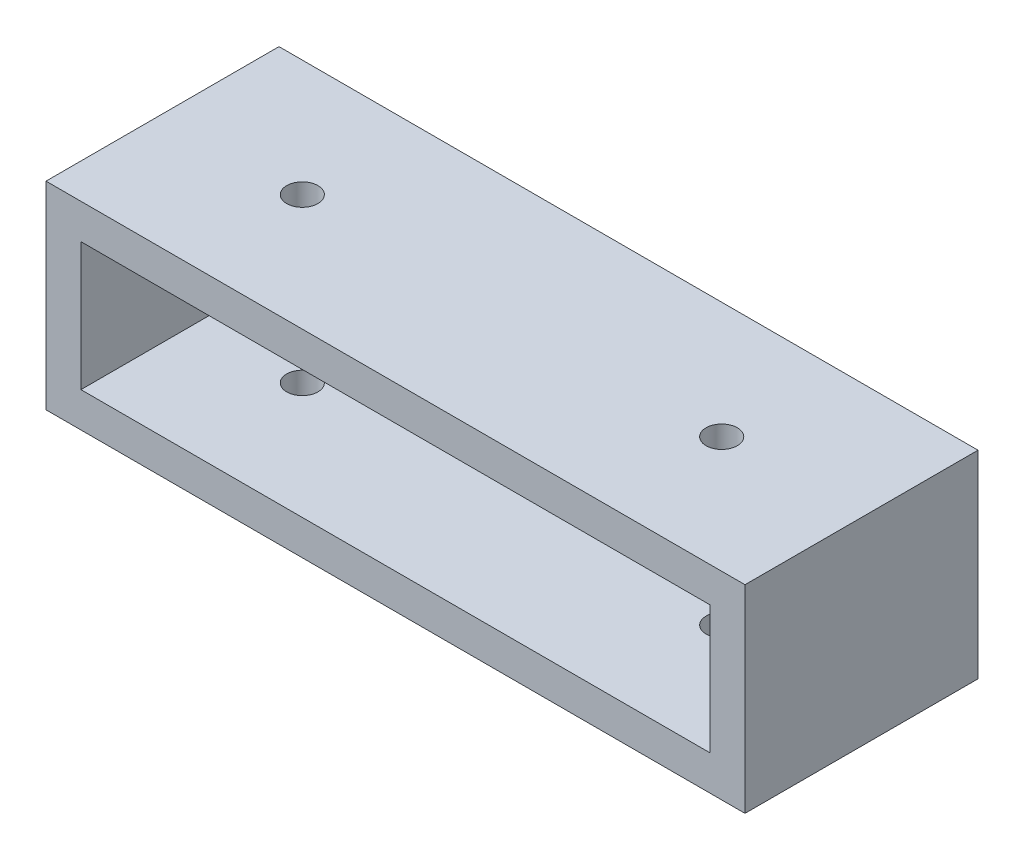
ISO-10303-21;
HEADER;
FILE_DESCRIPTION(('STEP AP214'),'2;1');
FILE_NAME('part.step','',(''),(''),'','','');
FILE_SCHEMA(('AUTOMOTIVE_DESIGN { 1 0 10303 214 1 1 1 1 }'));
ENDSEC;
DATA;
#1=APPLICATION_CONTEXT('core data for automotive mechanical design processes');
#2=APPLICATION_PROTOCOL_DEFINITION('international standard','automotive_design',2000,#1);
#3=PRODUCT_CONTEXT('',#1,'mechanical');
#4=PRODUCT('Part','Part','',(#3));
#5=PRODUCT_RELATED_PRODUCT_CATEGORY('part','',(#4));
#6=PRODUCT_DEFINITION_FORMATION('','',#4);
#7=PRODUCT_DEFINITION_CONTEXT('part definition',#1,'design');
#8=PRODUCT_DEFINITION('design','',#6,#7);
#9=PRODUCT_DEFINITION_SHAPE('','',#8);
#10=(LENGTH_UNIT() NAMED_UNIT(*) SI_UNIT(.MILLI.,.METRE.));
#11=(NAMED_UNIT(*) PLANE_ANGLE_UNIT() SI_UNIT($,.RADIAN.));
#12=(NAMED_UNIT(*) SI_UNIT($,.STERADIAN.) SOLID_ANGLE_UNIT());
#13=UNCERTAINTY_MEASURE_WITH_UNIT(LENGTH_MEASURE(1.E-05),#10,'distance_accuracy_value','');
#14=(GEOMETRIC_REPRESENTATION_CONTEXT(3) GLOBAL_UNCERTAINTY_ASSIGNED_CONTEXT((#13)) GLOBAL_UNIT_ASSIGNED_CONTEXT((#10,
#11,#12)) REPRESENTATION_CONTEXT('',''));
#15=CARTESIAN_POINT('',(0.,0.,0.));
#16=DIRECTION('',(0.,0.,1.));
#17=DIRECTION('',(1.,0.,0.));
#18=AXIS2_PLACEMENT_3D('',#15,#16,#17);
#19=CARTESIAN_POINT('',(0.,0.,0.));
#20=DIRECTION('',(0.,1.,0.));
#21=DIRECTION('',(0.,0.,1.));
#22=AXIS2_PLACEMENT_3D('',#19,#20,#21);
#23=PLANE('',#22);
#24=CARTESIAN_POINT('',(-45.,0.,0.));
#25=DIRECTION('',(0.,1.,0.));
#26=DIRECTION('',(0.,0.,1.));
#27=AXIS2_PLACEMENT_3D('',#24,#25,#26);
#28=CIRCLE('',#27,3.35);
#29=CARTESIAN_POINT('',(-45.,0.,3.35));
#30=VERTEX_POINT('',#29);
#31=EDGE_CURVE('E161',#30,#30,#28,.T.);
#32=ORIENTED_EDGE('',*,*,#31,.T.);
#33=EDGE_LOOP('',(#32));
#34=FACE_BOUND('',#33,.T.);
#35=CARTESIAN_POINT('',(45.,0.,0.));
#36=DIRECTION('',(0.,1.,0.));
#37=DIRECTION('',(0.,0.,1.));
#38=AXIS2_PLACEMENT_3D('',#35,#36,#37);
#39=CIRCLE('',#38,3.35);
#40=CARTESIAN_POINT('',(45.,0.,3.35));
#41=VERTEX_POINT('',#40);
#42=EDGE_CURVE('E168',#41,#41,#39,.T.);
#43=ORIENTED_EDGE('',*,*,#42,.T.);
#44=EDGE_LOOP('',(#43));
#45=FACE_BOUND('',#44,.T.);
#46=DIRECTION('',(-1.,0.,0.));
#47=VECTOR('',#46,1.);
#48=CARTESIAN_POINT('',(-75.,0.,-25.));
#49=LINE('',#48,#47);
#50=CARTESIAN_POINT('',(67.5,0.,-25.));
#51=VERTEX_POINT('',#50);
#52=CARTESIAN_POINT('',(-67.5,0.,-25.));
#53=VERTEX_POINT('',#52);
#54=EDGE_CURVE('E164',#51,#53,#49,.T.);
#55=ORIENTED_EDGE('',*,*,#54,.F.);
#56=DIRECTION('',(0.,0.,-1.));
#57=VECTOR('',#56,1.);
#58=CARTESIAN_POINT('',(67.5,0.,-25.));
#59=LINE('',#58,#57);
#60=CARTESIAN_POINT('',(67.5,0.,25.));
#61=VERTEX_POINT('',#60);
#62=EDGE_CURVE('E123',#61,#51,#59,.T.);
#63=ORIENTED_EDGE('',*,*,#62,.F.);
#64=DIRECTION('',(1.,0.,0.));
#65=VECTOR('',#64,1.);
#66=CARTESIAN_POINT('',(-75.,0.,25.));
#67=LINE('',#66,#65);
#68=CARTESIAN_POINT('',(-67.5,0.,25.));
#69=VERTEX_POINT('',#68);
#70=EDGE_CURVE('E176',#69,#61,#67,.T.);
#71=ORIENTED_EDGE('',*,*,#70,.F.);
#72=DIRECTION('',(0.,0.,1.));
#73=VECTOR('',#72,1.);
#74=CARTESIAN_POINT('',(-67.5,0.,25.));
#75=LINE('',#74,#73);
#76=EDGE_CURVE('E134',#53,#69,#75,.T.);
#77=ORIENTED_EDGE('',*,*,#76,.F.);
#78=EDGE_LOOP('',(#55,#63,#71,#77));
#79=FACE_BOUND('',#78,.T.);
#80=ADVANCED_FACE('F33',(#34,#45,#79),#23,.F.);
#81=CARTESIAN_POINT('',(75.,7.5,-25.));
#82=DIRECTION('',(-1.,0.,0.));
#83=DIRECTION('',(0.,0.,1.));
#84=AXIS2_PLACEMENT_3D('',#81,#82,#83);
#85=PLANE('',#84);
#86=DIRECTION('',(0.,-1.,0.));
#87=VECTOR('',#86,1.);
#88=CARTESIAN_POINT('',(75.,7.5,25.));
#89=LINE('',#88,#87);
#90=CARTESIAN_POINT('',(75.,7.5,25.));
#91=VERTEX_POINT('',#90);
#92=CARTESIAN_POINT('',(75.,-35.,25.));
#93=VERTEX_POINT('',#92);
#94=EDGE_CURVE('E180',#91,#93,#89,.T.);
#95=ORIENTED_EDGE('',*,*,#94,.T.);
#96=DIRECTION('',(0.,0.,1.));
#97=VECTOR('',#96,1.);
#98=CARTESIAN_POINT('',(75.,-35.,25.));
#99=LINE('',#98,#97);
#100=CARTESIAN_POINT('',(75.,-35.,-25.));
#101=VERTEX_POINT('',#100);
#102=EDGE_CURVE('E109',#101,#93,#99,.T.);
#103=ORIENTED_EDGE('',*,*,#102,.F.);
#104=DIRECTION('',(0.,-1.,0.));
#105=VECTOR('',#104,1.);
#106=CARTESIAN_POINT('',(75.,7.5,-25.));
#107=LINE('',#106,#105);
#108=CARTESIAN_POINT('',(75.,7.5,-25.));
#109=VERTEX_POINT('',#108);
#110=EDGE_CURVE('E11',#109,#101,#107,.T.);
#111=ORIENTED_EDGE('',*,*,#110,.F.);
#112=DIRECTION('',(0.,0.,-1.));
#113=VECTOR('',#112,1.);
#114=CARTESIAN_POINT('',(75.,7.5,-25.));
#115=LINE('',#114,#113);
#116=EDGE_CURVE('E173',#91,#109,#115,.T.);
#117=ORIENTED_EDGE('',*,*,#116,.F.);
#118=EDGE_LOOP('',(#95,#103,#111,#117));
#119=FACE_BOUND('',#118,.T.);
#120=ADVANCED_FACE('F35',(#119),#85,.F.);
#121=CARTESIAN_POINT('',(-75.,7.5,-25.));
#122=DIRECTION('',(0.,0.,1.));
#123=DIRECTION('',(1.,0.,0.));
#124=AXIS2_PLACEMENT_3D('',#121,#122,#123);
#125=PLANE('',#124);
#126=DIRECTION('',(0.,-1.,0.));
#127=VECTOR('',#126,1.);
#128=CARTESIAN_POINT('',(67.5,0.,-25.));
#129=LINE('',#128,#127);
#130=CARTESIAN_POINT('',(67.5,-27.5,-25.));
#131=VERTEX_POINT('',#130);
#132=EDGE_CURVE('E103',#51,#131,#129,.T.);
#133=ORIENTED_EDGE('',*,*,#132,.F.);
#134=ORIENTED_EDGE('',*,*,#54,.T.);
#135=DIRECTION('',(0.,1.,0.));
#136=VECTOR('',#135,1.);
#137=CARTESIAN_POINT('',(-67.5,0.,-25.));
#138=LINE('',#137,#136);
#139=CARTESIAN_POINT('',(-67.5,-27.5,-25.));
#140=VERTEX_POINT('',#139);
#141=EDGE_CURVE('E105',#140,#53,#138,.T.);
#142=ORIENTED_EDGE('',*,*,#141,.F.);
#143=DIRECTION('',(-1.,0.,0.));
#144=VECTOR('',#143,1.);
#145=CARTESIAN_POINT('',(60.,-27.5,-25.));
#146=LINE('',#145,#144);
#147=EDGE_CURVE('E98',#131,#140,#146,.T.);
#148=ORIENTED_EDGE('',*,*,#147,.F.);
#149=EDGE_LOOP('',(#133,#134,#142,#148));
#150=FACE_BOUND('',#149,.T.);
#151=ORIENTED_EDGE('',*,*,#110,.T.);
#152=DIRECTION('',(1.,0.,0.));
#153=VECTOR('',#152,1.);
#154=CARTESIAN_POINT('',(-75.,-35.,-25.));
#155=LINE('',#154,#153);
#156=CARTESIAN_POINT('',(-75.,-35.,-25.));
#157=VERTEX_POINT('',#156);
#158=EDGE_CURVE('E155',#157,#101,#155,.T.);
#159=ORIENTED_EDGE('',*,*,#158,.F.);
#160=DIRECTION('',(0.,-1.,0.));
#161=VECTOR('',#160,1.);
#162=CARTESIAN_POINT('',(-75.,7.5,-25.));
#163=LINE('',#162,#161);
#164=CARTESIAN_POINT('',(-75.,7.5,-25.));
#165=VERTEX_POINT('',#164);
#166=EDGE_CURVE('E41',#165,#157,#163,.T.);
#167=ORIENTED_EDGE('',*,*,#166,.F.);
#168=DIRECTION('',(-1.,0.,0.));
#169=VECTOR('',#168,1.);
#170=CARTESIAN_POINT('',(-75.,7.5,-25.));
#171=LINE('',#170,#169);
#172=EDGE_CURVE('E175',#109,#165,#171,.T.);
#173=ORIENTED_EDGE('',*,*,#172,.F.);
#174=EDGE_LOOP('',(#151,#159,#167,#173));
#175=FACE_BOUND('',#174,.T.);
#176=ADVANCED_FACE('F100',(#150,#175),#125,.F.);
#177=CARTESIAN_POINT('',(-75.,7.5,-25.));
#178=DIRECTION('',(1.,0.,0.));
#179=DIRECTION('',(0.,0.,-1.));
#180=AXIS2_PLACEMENT_3D('',#177,#178,#179);
#181=PLANE('',#180);
#182=ORIENTED_EDGE('',*,*,#166,.T.);
#183=DIRECTION('',(0.,0.,-1.));
#184=VECTOR('',#183,1.);
#185=CARTESIAN_POINT('',(-75.,-35.,25.));
#186=LINE('',#185,#184);
#187=CARTESIAN_POINT('',(-75.,-35.,25.));
#188=VERTEX_POINT('',#187);
#189=EDGE_CURVE('E152',#188,#157,#186,.T.);
#190=ORIENTED_EDGE('',*,*,#189,.F.);
#191=DIRECTION('',(0.,-1.,0.));
#192=VECTOR('',#191,1.);
#193=CARTESIAN_POINT('',(-75.,7.5,25.));
#194=LINE('',#193,#192);
#195=CARTESIAN_POINT('',(-75.,7.5,25.));
#196=VERTEX_POINT('',#195);
#197=EDGE_CURVE('E185',#196,#188,#194,.T.);
#198=ORIENTED_EDGE('',*,*,#197,.F.);
#199=DIRECTION('',(0.,0.,1.));
#200=VECTOR('',#199,1.);
#201=CARTESIAN_POINT('',(-75.,7.5,-25.));
#202=LINE('',#201,#200);
#203=EDGE_CURVE('E53',#165,#196,#202,.T.);
#204=ORIENTED_EDGE('',*,*,#203,.F.);
#205=EDGE_LOOP('',(#182,#190,#198,#204));
#206=FACE_BOUND('',#205,.T.);
#207=ADVANCED_FACE('F190',(#206),#181,.F.);
#208=CARTESIAN_POINT('',(-75.,7.5,25.));
#209=DIRECTION('',(0.,0.,-1.));
#210=DIRECTION('',(-1.,0.,0.));
#211=AXIS2_PLACEMENT_3D('',#208,#209,#210);
#212=PLANE('',#211);
#213=ORIENTED_EDGE('',*,*,#70,.T.);
#214=DIRECTION('',(0.,1.,0.));
#215=VECTOR('',#214,1.);
#216=CARTESIAN_POINT('',(67.5,0.,25.));
#217=LINE('',#216,#215);
#218=CARTESIAN_POINT('',(67.5,-27.5,25.));
#219=VERTEX_POINT('',#218);
#220=EDGE_CURVE('E118',#219,#61,#217,.T.);
#221=ORIENTED_EDGE('',*,*,#220,.F.);
#222=DIRECTION('',(-1.,0.,0.));
#223=VECTOR('',#222,1.);
#224=CARTESIAN_POINT('',(60.,-27.5,25.));
#225=LINE('',#224,#223);
#226=CARTESIAN_POINT('',(-67.5,-27.5,25.));
#227=VERTEX_POINT('',#226);
#228=EDGE_CURVE('E110',#219,#227,#225,.T.);
#229=ORIENTED_EDGE('',*,*,#228,.T.);
#230=DIRECTION('',(0.,-1.,0.));
#231=VECTOR('',#230,1.);
#232=CARTESIAN_POINT('',(-67.5,0.,25.));
#233=LINE('',#232,#231);
#234=EDGE_CURVE('E128',#69,#227,#233,.T.);
#235=ORIENTED_EDGE('',*,*,#234,.F.);
#236=EDGE_LOOP('',(#213,#221,#229,#235));
#237=FACE_BOUND('',#236,.T.);
#238=ORIENTED_EDGE('',*,*,#197,.T.);
#239=DIRECTION('',(-1.,0.,0.));
#240=VECTOR('',#239,1.);
#241=CARTESIAN_POINT('',(-75.,-35.,25.));
#242=LINE('',#241,#240);
#243=EDGE_CURVE('E157',#93,#188,#242,.T.);
#244=ORIENTED_EDGE('',*,*,#243,.F.);
#245=ORIENTED_EDGE('',*,*,#94,.F.);
#246=DIRECTION('',(1.,0.,0.));
#247=VECTOR('',#246,1.);
#248=CARTESIAN_POINT('',(-75.,7.5,25.));
#249=LINE('',#248,#247);
#250=EDGE_CURVE('E48',#196,#91,#249,.T.);
#251=ORIENTED_EDGE('',*,*,#250,.F.);
#252=EDGE_LOOP('',(#238,#244,#245,#251));
#253=FACE_BOUND('',#252,.T.);
#254=ADVANCED_FACE('F196',(#237,#253),#212,.F.);
#255=CARTESIAN_POINT('',(0.,7.5,0.));
#256=DIRECTION('',(0.,1.,0.));
#257=DIRECTION('',(0.,0.,1.));
#258=AXIS2_PLACEMENT_3D('',#255,#256,#257);
#259=PLANE('',#258);
#260=CARTESIAN_POINT('',(-45.,7.5,0.));
#261=DIRECTION('',(0.,1.,0.));
#262=DIRECTION('',(0.,0.,1.));
#263=AXIS2_PLACEMENT_3D('',#260,#261,#262);
#264=CIRCLE('',#263,3.35);
#265=CARTESIAN_POINT('',(-45.,7.5,3.35));
#266=VERTEX_POINT('',#265);
#267=EDGE_CURVE('E165',#266,#266,#264,.T.);
#268=ORIENTED_EDGE('',*,*,#267,.F.);
#269=EDGE_LOOP('',(#268));
#270=FACE_BOUND('',#269,.T.);
#271=CARTESIAN_POINT('',(45.,7.5,0.));
#272=DIRECTION('',(0.,1.,0.));
#273=DIRECTION('',(0.,0.,1.));
#274=AXIS2_PLACEMENT_3D('',#271,#272,#273);
#275=CIRCLE('',#274,3.35);
#276=CARTESIAN_POINT('',(45.,7.5,3.35));
#277=VERTEX_POINT('',#276);
#278=EDGE_CURVE('E160',#277,#277,#275,.T.);
#279=ORIENTED_EDGE('',*,*,#278,.F.);
#280=EDGE_LOOP('',(#279));
#281=FACE_BOUND('',#280,.T.);
#282=ORIENTED_EDGE('',*,*,#116,.T.);
#283=ORIENTED_EDGE('',*,*,#172,.T.);
#284=ORIENTED_EDGE('',*,*,#203,.T.);
#285=ORIENTED_EDGE('',*,*,#250,.T.);
#286=EDGE_LOOP('',(#282,#283,#284,#285));
#287=FACE_BOUND('',#286,.T.);
#288=ADVANCED_FACE('F199',(#270,#281,#287),#259,.T.);
#289=CARTESIAN_POINT('',(45.,0.,0.));
#290=DIRECTION('',(0.,1.,0.));
#291=DIRECTION('',(0.,0.,1.));
#292=AXIS2_PLACEMENT_3D('',#289,#290,#291);
#293=CYLINDRICAL_SURFACE('',#292,3.35);
#294=ORIENTED_EDGE('',*,*,#42,.F.);
#295=EDGE_LOOP('',(#294));
#296=FACE_BOUND('',#295,.T.);
#297=ORIENTED_EDGE('',*,*,#278,.T.);
#298=EDGE_LOOP('',(#297));
#299=FACE_BOUND('',#298,.T.);
#300=ADVANCED_FACE('F201',(#296,#299),#293,.F.);
#301=CARTESIAN_POINT('',(-45.,0.,0.));
#302=DIRECTION('',(0.,1.,0.));
#303=DIRECTION('',(0.,0.,1.));
#304=AXIS2_PLACEMENT_3D('',#301,#302,#303);
#305=CYLINDRICAL_SURFACE('',#304,3.35);
#306=ORIENTED_EDGE('',*,*,#31,.F.);
#307=EDGE_LOOP('',(#306));
#308=FACE_BOUND('',#307,.T.);
#309=ORIENTED_EDGE('',*,*,#267,.T.);
#310=EDGE_LOOP('',(#309));
#311=FACE_BOUND('',#310,.T.);
#312=ADVANCED_FACE('F208',(#308,#311),#305,.F.);
#313=CARTESIAN_POINT('',(0.,-35.,0.));
#314=DIRECTION('',(0.,-1.,0.));
#315=DIRECTION('',(0.,0.,-1.));
#316=AXIS2_PLACEMENT_3D('',#313,#314,#315);
#317=PLANE('',#316);
#318=CARTESIAN_POINT('',(-45.,-35.,0.));
#319=DIRECTION('',(0.,1.,0.));
#320=DIRECTION('',(0.,0.,1.));
#321=AXIS2_PLACEMENT_3D('',#318,#319,#320);
#322=CIRCLE('',#321,3.35);
#323=CARTESIAN_POINT('',(-45.,-35.,3.35));
#324=VERTEX_POINT('',#323);
#325=EDGE_CURVE('E138',#324,#324,#322,.T.);
#326=ORIENTED_EDGE('',*,*,#325,.T.);
#327=EDGE_LOOP('',(#326));
#328=FACE_BOUND('',#327,.T.);
#329=CARTESIAN_POINT('',(45.,-35.,0.));
#330=DIRECTION('',(0.,1.,0.));
#331=DIRECTION('',(0.,0.,1.));
#332=AXIS2_PLACEMENT_3D('',#329,#330,#331);
#333=CIRCLE('',#332,3.35);
#334=CARTESIAN_POINT('',(45.,-35.,3.35));
#335=VERTEX_POINT('',#334);
#336=EDGE_CURVE('E144',#335,#335,#333,.T.);
#337=ORIENTED_EDGE('',*,*,#336,.T.);
#338=EDGE_LOOP('',(#337));
#339=FACE_BOUND('',#338,.T.);
#340=ORIENTED_EDGE('',*,*,#189,.T.);
#341=ORIENTED_EDGE('',*,*,#158,.T.);
#342=ORIENTED_EDGE('',*,*,#102,.T.);
#343=ORIENTED_EDGE('',*,*,#243,.T.);
#344=EDGE_LOOP('',(#340,#341,#342,#343));
#345=FACE_BOUND('',#344,.T.);
#346=ADVANCED_FACE('F194',(#328,#339,#345),#317,.T.);
#347=CARTESIAN_POINT('',(60.,-27.5,25.));
#348=DIRECTION('',(0.,-1.,0.));
#349=DIRECTION('',(0.,0.,-1.));
#350=AXIS2_PLACEMENT_3D('',#347,#348,#349);
#351=PLANE('',#350);
#352=CARTESIAN_POINT('',(-45.,-27.5,0.));
#353=DIRECTION('',(0.,1.,0.));
#354=DIRECTION('',(0.,0.,1.));
#355=AXIS2_PLACEMENT_3D('',#352,#353,#354);
#356=CIRCLE('',#355,3.35);
#357=CARTESIAN_POINT('',(-45.,-27.5,3.35));
#358=VERTEX_POINT('',#357);
#359=EDGE_CURVE('E141',#358,#358,#356,.T.);
#360=ORIENTED_EDGE('',*,*,#359,.F.);
#361=EDGE_LOOP('',(#360));
#362=FACE_BOUND('',#361,.T.);
#363=CARTESIAN_POINT('',(45.,-27.5,0.));
#364=DIRECTION('',(0.,1.,0.));
#365=DIRECTION('',(0.,0.,1.));
#366=AXIS2_PLACEMENT_3D('',#363,#364,#365);
#367=CIRCLE('',#366,3.35);
#368=CARTESIAN_POINT('',(45.,-27.5,3.35));
#369=VERTEX_POINT('',#368);
#370=EDGE_CURVE('E137',#369,#369,#367,.T.);
#371=ORIENTED_EDGE('',*,*,#370,.F.);
#372=EDGE_LOOP('',(#371));
#373=FACE_BOUND('',#372,.T.);
#374=ORIENTED_EDGE('',*,*,#147,.T.);
#375=DIRECTION('',(0.,0.,-1.));
#376=VECTOR('',#375,1.);
#377=CARTESIAN_POINT('',(-67.5,-27.5,25.));
#378=LINE('',#377,#376);
#379=EDGE_CURVE('E131',#227,#140,#378,.T.);
#380=ORIENTED_EDGE('',*,*,#379,.F.);
#381=ORIENTED_EDGE('',*,*,#228,.F.);
#382=DIRECTION('',(0.,0.,1.));
#383=VECTOR('',#382,1.);
#384=CARTESIAN_POINT('',(67.5,-27.5,-25.));
#385=LINE('',#384,#383);
#386=EDGE_CURVE('E113',#131,#219,#385,.T.);
#387=ORIENTED_EDGE('',*,*,#386,.F.);
#388=EDGE_LOOP('',(#374,#380,#381,#387));
#389=FACE_BOUND('',#388,.T.);
#390=ADVANCED_FACE('F114',(#362,#373,#389),#351,.F.);
#391=CARTESIAN_POINT('',(45.,-35.,0.));
#392=DIRECTION('',(0.,1.,0.));
#393=DIRECTION('',(0.,0.,1.));
#394=AXIS2_PLACEMENT_3D('',#391,#392,#393);
#395=CYLINDRICAL_SURFACE('',#394,3.35);
#396=ORIENTED_EDGE('',*,*,#336,.F.);
#397=EDGE_LOOP('',(#396));
#398=FACE_BOUND('',#397,.T.);
#399=ORIENTED_EDGE('',*,*,#370,.T.);
#400=EDGE_LOOP('',(#399));
#401=FACE_BOUND('',#400,.T.);
#402=ADVANCED_FACE('F249',(#398,#401),#395,.F.);
#403=CARTESIAN_POINT('',(-45.,-35.,0.));
#404=DIRECTION('',(0.,1.,0.));
#405=DIRECTION('',(0.,0.,1.));
#406=AXIS2_PLACEMENT_3D('',#403,#404,#405);
#407=CYLINDRICAL_SURFACE('',#406,3.35);
#408=ORIENTED_EDGE('',*,*,#325,.F.);
#409=EDGE_LOOP('',(#408));
#410=FACE_BOUND('',#409,.T.);
#411=ORIENTED_EDGE('',*,*,#359,.T.);
#412=EDGE_LOOP('',(#411));
#413=FACE_BOUND('',#412,.T.);
#414=ADVANCED_FACE('F271',(#410,#413),#407,.F.);
#415=CARTESIAN_POINT('',(-67.5,0.,0.));
#416=DIRECTION('',(1.,0.,0.));
#417=DIRECTION('',(0.,0.,-1.));
#418=AXIS2_PLACEMENT_3D('',#415,#416,#417);
#419=PLANE('',#418);
#420=ORIENTED_EDGE('',*,*,#234,.T.);
#421=ORIENTED_EDGE('',*,*,#379,.T.);
#422=ORIENTED_EDGE('',*,*,#141,.T.);
#423=ORIENTED_EDGE('',*,*,#76,.T.);
#424=EDGE_LOOP('',(#420,#421,#422,#423));
#425=FACE_BOUND('',#424,.T.);
#426=ADVANCED_FACE('F262',(#425),#419,.T.);
#427=CARTESIAN_POINT('',(67.5,0.,0.));
#428=DIRECTION('',(-1.,0.,0.));
#429=DIRECTION('',(0.,0.,1.));
#430=AXIS2_PLACEMENT_3D('',#427,#428,#429);
#431=PLANE('',#430);
#432=ORIENTED_EDGE('',*,*,#132,.T.);
#433=ORIENTED_EDGE('',*,*,#386,.T.);
#434=ORIENTED_EDGE('',*,*,#220,.T.);
#435=ORIENTED_EDGE('',*,*,#62,.T.);
#436=EDGE_LOOP('',(#432,#433,#434,#435));
#437=FACE_BOUND('',#436,.T.);
#438=ADVANCED_FACE('F121',(#437),#431,.T.);
#439=CLOSED_SHELL('',(#80,#120,#176,#207,#254,#288,#300,#312,#346,#390,#402,#414,#426,#438));
#440=MANIFOLD_SOLID_BREP('B2',#439);
#441=ADVANCED_BREP_SHAPE_REPRESENTATION('',(#18,#440),#14);
#442=SHAPE_DEFINITION_REPRESENTATION(#9,#441);
ENDSEC;
END-ISO-10303-21;
